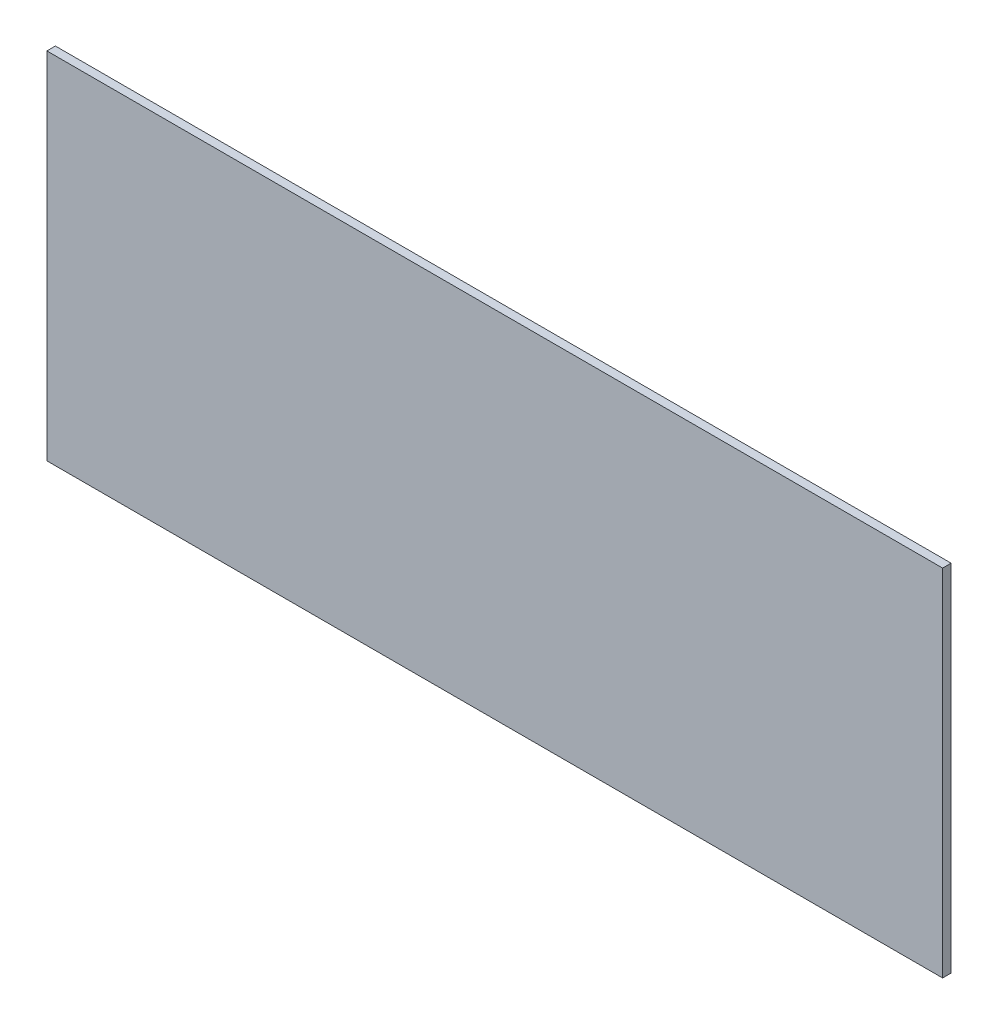
ISO-10303-21;
HEADER;
FILE_DESCRIPTION(('STEP AP214'),'2;1');
FILE_NAME('part.step','',(''),(''),'','','');
FILE_SCHEMA(('AUTOMOTIVE_DESIGN { 1 0 10303 214 1 1 1 1 }'));
ENDSEC;
DATA;
#1=APPLICATION_CONTEXT('core data for automotive mechanical design processes');
#2=APPLICATION_PROTOCOL_DEFINITION('international standard','automotive_design',2000,#1);
#3=PRODUCT_CONTEXT('',#1,'mechanical');
#4=PRODUCT('Part','Part','',(#3));
#5=PRODUCT_RELATED_PRODUCT_CATEGORY('part','',(#4));
#6=PRODUCT_DEFINITION_FORMATION('','',#4);
#7=PRODUCT_DEFINITION_CONTEXT('part definition',#1,'design');
#8=PRODUCT_DEFINITION('design','',#6,#7);
#9=PRODUCT_DEFINITION_SHAPE('','',#8);
#10=(LENGTH_UNIT() NAMED_UNIT(*) SI_UNIT(.MILLI.,.METRE.));
#11=(NAMED_UNIT(*) PLANE_ANGLE_UNIT() SI_UNIT($,.RADIAN.));
#12=(NAMED_UNIT(*) SI_UNIT($,.STERADIAN.) SOLID_ANGLE_UNIT());
#13=UNCERTAINTY_MEASURE_WITH_UNIT(LENGTH_MEASURE(1.E-05),#10,'distance_accuracy_value','');
#14=(GEOMETRIC_REPRESENTATION_CONTEXT(3) GLOBAL_UNCERTAINTY_ASSIGNED_CONTEXT((#13)) GLOBAL_UNIT_ASSIGNED_CONTEXT((#10,
#11,#12)) REPRESENTATION_CONTEXT('',''));
#15=CARTESIAN_POINT('',(0.,0.,0.));
#16=DIRECTION('',(0.,0.,1.));
#17=DIRECTION('',(1.,0.,0.));
#18=AXIS2_PLACEMENT_3D('',#15,#16,#17);
#19=CARTESIAN_POINT('',(294.4119969,-116.6880064,5.588));
#20=DIRECTION('',(-1.,0.,0.));
#21=DIRECTION('',(0.,0.,1.));
#22=AXIS2_PLACEMENT_3D('',#19,#20,#21);
#23=PLANE('',#22);
#24=DIRECTION('',(0.,1.,0.));
#25=VECTOR('',#24,1.);
#26=CARTESIAN_POINT('',(294.4119969,-116.6880064,0.));
#27=LINE('',#26,#25);
#28=CARTESIAN_POINT('',(294.4119969,-116.6880064,0.));
#29=VERTEX_POINT('',#28);
#30=CARTESIAN_POINT('',(294.4119969,116.6880064,0.));
#31=VERTEX_POINT('',#30);
#32=EDGE_CURVE('E100',#29,#31,#27,.T.);
#33=ORIENTED_EDGE('',*,*,#32,.T.);
#34=DIRECTION('',(0.,0.,-1.));
#35=VECTOR('',#34,1.);
#36=CARTESIAN_POINT('',(294.4119969,116.6880064,5.588));
#37=LINE('',#36,#35);
#38=CARTESIAN_POINT('',(294.4119969,116.6880064,5.588));
#39=VERTEX_POINT('',#38);
#40=EDGE_CURVE('E11',#39,#31,#37,.T.);
#41=ORIENTED_EDGE('',*,*,#40,.F.);
#42=DIRECTION('',(0.,1.,0.));
#43=VECTOR('',#42,1.);
#44=CARTESIAN_POINT('',(294.4119969,-116.6880064,5.588));
#45=LINE('',#44,#43);
#46=CARTESIAN_POINT('',(294.4119969,-116.6880064,5.588));
#47=VERTEX_POINT('',#46);
#48=EDGE_CURVE('E88',#47,#39,#45,.T.);
#49=ORIENTED_EDGE('',*,*,#48,.F.);
#50=DIRECTION('',(0.,0.,-1.));
#51=VECTOR('',#50,1.);
#52=CARTESIAN_POINT('',(294.4119969,-116.6880064,5.588));
#53=LINE('',#52,#51);
#54=EDGE_CURVE('E96',#47,#29,#53,.T.);
#55=ORIENTED_EDGE('',*,*,#54,.T.);
#56=EDGE_LOOP('',(#33,#41,#49,#55));
#57=FACE_BOUND('',#56,.T.);
#58=ADVANCED_FACE('F37',(#57),#23,.F.);
#59=CARTESIAN_POINT('',(-294.4119969,116.6880064,5.588));
#60=DIRECTION('',(0.,-1.,0.));
#61=DIRECTION('',(0.,0.,-1.));
#62=AXIS2_PLACEMENT_3D('',#59,#60,#61);
#63=PLANE('',#62);
#64=DIRECTION('',(-1.,0.,0.));
#65=VECTOR('',#64,1.);
#66=CARTESIAN_POINT('',(-294.4119969,116.6880064,0.));
#67=LINE('',#66,#65);
#68=CARTESIAN_POINT('',(-294.4119969,116.6880064,0.));
#69=VERTEX_POINT('',#68);
#70=EDGE_CURVE('E92',#31,#69,#67,.T.);
#71=ORIENTED_EDGE('',*,*,#70,.T.);
#72=DIRECTION('',(0.,0.,-1.));
#73=VECTOR('',#72,1.);
#74=CARTESIAN_POINT('',(-294.4119969,116.6880064,5.588));
#75=LINE('',#74,#73);
#76=CARTESIAN_POINT('',(-294.4119969,116.6880064,5.588));
#77=VERTEX_POINT('',#76);
#78=EDGE_CURVE('E45',#77,#69,#75,.T.);
#79=ORIENTED_EDGE('',*,*,#78,.F.);
#80=DIRECTION('',(-1.,0.,0.));
#81=VECTOR('',#80,1.);
#82=CARTESIAN_POINT('',(-294.4119969,116.6880064,5.588));
#83=LINE('',#82,#81);
#84=EDGE_CURVE('E83',#39,#77,#83,.T.);
#85=ORIENTED_EDGE('',*,*,#84,.F.);
#86=ORIENTED_EDGE('',*,*,#40,.T.);
#87=EDGE_LOOP('',(#71,#79,#85,#86));
#88=FACE_BOUND('',#87,.T.);
#89=ADVANCED_FACE('F91',(#88),#63,.F.);
#90=CARTESIAN_POINT('',(-294.4119969,-116.6880064,5.588));
#91=DIRECTION('',(1.,0.,0.));
#92=DIRECTION('',(0.,0.,-1.));
#93=AXIS2_PLACEMENT_3D('',#90,#91,#92);
#94=PLANE('',#93);
#95=DIRECTION('',(0.,-1.,0.));
#96=VECTOR('',#95,1.);
#97=CARTESIAN_POINT('',(-294.4119969,-116.6880064,0.));
#98=LINE('',#97,#96);
#99=CARTESIAN_POINT('',(-294.4119969,-116.6880064,0.));
#100=VERTEX_POINT('',#99);
#101=EDGE_CURVE('E70',#69,#100,#98,.T.);
#102=ORIENTED_EDGE('',*,*,#101,.T.);
#103=DIRECTION('',(0.,0.,-1.));
#104=VECTOR('',#103,1.);
#105=CARTESIAN_POINT('',(-294.4119969,-116.6880064,5.588));
#106=LINE('',#105,#104);
#107=CARTESIAN_POINT('',(-294.4119969,-116.6880064,5.588));
#108=VERTEX_POINT('',#107);
#109=EDGE_CURVE('E93',#108,#100,#106,.T.);
#110=ORIENTED_EDGE('',*,*,#109,.F.);
#111=DIRECTION('',(0.,-1.,0.));
#112=VECTOR('',#111,1.);
#113=CARTESIAN_POINT('',(-294.4119969,-116.6880064,5.588));
#114=LINE('',#113,#112);
#115=EDGE_CURVE('E86',#77,#108,#114,.T.);
#116=ORIENTED_EDGE('',*,*,#115,.F.);
#117=ORIENTED_EDGE('',*,*,#78,.T.);
#118=EDGE_LOOP('',(#102,#110,#116,#117));
#119=FACE_BOUND('',#118,.T.);
#120=ADVANCED_FACE('F94',(#119),#94,.F.);
#121=CARTESIAN_POINT('',(-294.4119969,-116.6880064,5.588));
#122=DIRECTION('',(0.,1.,0.));
#123=DIRECTION('',(0.,0.,1.));
#124=AXIS2_PLACEMENT_3D('',#121,#122,#123);
#125=PLANE('',#124);
#126=DIRECTION('',(1.,0.,0.));
#127=VECTOR('',#126,1.);
#128=CARTESIAN_POINT('',(-294.4119969,-116.6880064,0.));
#129=LINE('',#128,#127);
#130=EDGE_CURVE('E76',#100,#29,#129,.T.);
#131=ORIENTED_EDGE('',*,*,#130,.T.);
#132=ORIENTED_EDGE('',*,*,#54,.F.);
#133=DIRECTION('',(1.,0.,0.));
#134=VECTOR('',#133,1.);
#135=CARTESIAN_POINT('',(-294.4119969,-116.6880064,5.588));
#136=LINE('',#135,#134);
#137=EDGE_CURVE('E53',#108,#47,#136,.T.);
#138=ORIENTED_EDGE('',*,*,#137,.F.);
#139=ORIENTED_EDGE('',*,*,#109,.T.);
#140=EDGE_LOOP('',(#131,#132,#138,#139));
#141=FACE_BOUND('',#140,.T.);
#142=ADVANCED_FACE('F107',(#141),#125,.F.);
#143=CARTESIAN_POINT('',(0.,0.,5.588));
#144=DIRECTION('',(0.,0.,-1.));
#145=DIRECTION('',(-1.,0.,0.));
#146=AXIS2_PLACEMENT_3D('',#143,#144,#145);
#147=PLANE('',#146);
#148=ORIENTED_EDGE('',*,*,#48,.T.);
#149=ORIENTED_EDGE('',*,*,#84,.T.);
#150=ORIENTED_EDGE('',*,*,#115,.T.);
#151=ORIENTED_EDGE('',*,*,#137,.T.);
#152=EDGE_LOOP('',(#148,#149,#150,#151));
#153=FACE_BOUND('',#152,.T.);
#154=ADVANCED_FACE('F84',(#153),#147,.F.);
#155=CARTESIAN_POINT('',(0.,0.,0.));
#156=DIRECTION('',(0.,0.,-1.));
#157=DIRECTION('',(-1.,0.,0.));
#158=AXIS2_PLACEMENT_3D('',#155,#156,#157);
#159=PLANE('',#158);
#160=ORIENTED_EDGE('',*,*,#32,.F.);
#161=ORIENTED_EDGE('',*,*,#130,.F.);
#162=ORIENTED_EDGE('',*,*,#101,.F.);
#163=ORIENTED_EDGE('',*,*,#70,.F.);
#164=EDGE_LOOP('',(#160,#161,#162,#163));
#165=FACE_BOUND('',#164,.T.);
#166=ADVANCED_FACE('F110',(#165),#159,.T.);
#167=CLOSED_SHELL('',(#58,#89,#120,#142,#154,#166));
#168=MANIFOLD_SOLID_BREP('B2',#167);
#169=ADVANCED_BREP_SHAPE_REPRESENTATION('',(#18,#168),#14);
#170=SHAPE_DEFINITION_REPRESENTATION(#9,#169);
ENDSEC;
END-ISO-10303-21;
